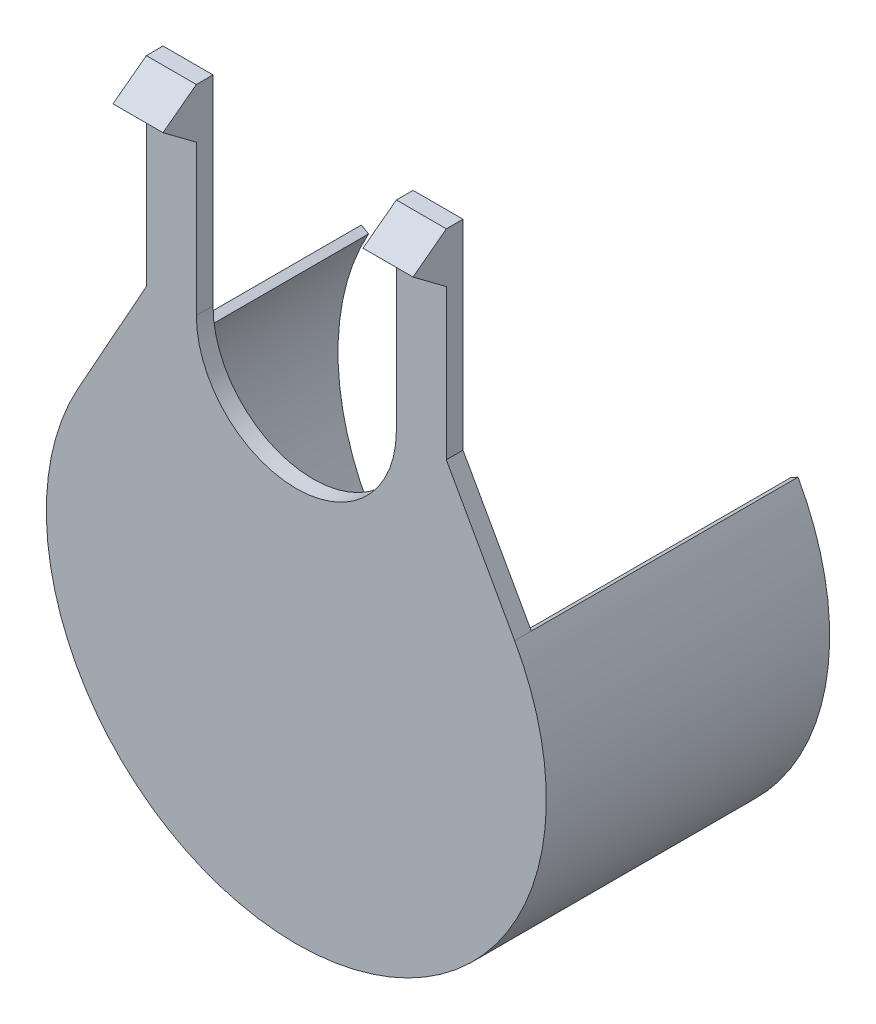
ISO-10303-21;
HEADER;
FILE_DESCRIPTION(('STEP AP214'),'2;1');
FILE_NAME('part.step','',(''),(''),'','','');
FILE_SCHEMA(('AUTOMOTIVE_DESIGN { 1 0 10303 214 1 1 1 1 }'));
ENDSEC;
DATA;
#1=APPLICATION_CONTEXT('core data for automotive mechanical design processes');
#2=APPLICATION_PROTOCOL_DEFINITION('international standard','automotive_design',2000,#1);
#3=PRODUCT_CONTEXT('',#1,'mechanical');
#4=PRODUCT('Part','Part','',(#3));
#5=PRODUCT_RELATED_PRODUCT_CATEGORY('part','',(#4));
#6=PRODUCT_DEFINITION_FORMATION('','',#4);
#7=PRODUCT_DEFINITION_CONTEXT('part definition',#1,'design');
#8=PRODUCT_DEFINITION('design','',#6,#7);
#9=PRODUCT_DEFINITION_SHAPE('','',#8);
#10=(LENGTH_UNIT() NAMED_UNIT(*) SI_UNIT(.MILLI.,.METRE.));
#11=(NAMED_UNIT(*) PLANE_ANGLE_UNIT() SI_UNIT($,.RADIAN.));
#12=(NAMED_UNIT(*) SI_UNIT($,.STERADIAN.) SOLID_ANGLE_UNIT());
#13=UNCERTAINTY_MEASURE_WITH_UNIT(LENGTH_MEASURE(1.E-05),#10,'distance_accuracy_value','');
#14=(GEOMETRIC_REPRESENTATION_CONTEXT(3) GLOBAL_UNCERTAINTY_ASSIGNED_CONTEXT((#13)) GLOBAL_UNIT_ASSIGNED_CONTEXT((#10,
#11,#12)) REPRESENTATION_CONTEXT('',''));
#15=CARTESIAN_POINT('',(0.,0.,0.));
#16=DIRECTION('',(0.,0.,1.));
#17=DIRECTION('',(1.,0.,0.));
#18=AXIS2_PLACEMENT_3D('',#15,#16,#17);
#19=CARTESIAN_POINT('',(0.,-73.2878763910552,5.));
#20=DIRECTION('',(0.,0.,1.));
#21=DIRECTION('',(1.,0.,0.));
#22=AXIS2_PLACEMENT_3D('',#19,#20,#21);
#23=PLANE('',#22);
#24=DIRECTION('',(0.,1.,0.));
#25=VECTOR('',#24,1.);
#26=CARTESIAN_POINT('',(-30.,0.,5.));
#27=LINE('',#26,#25);
#28=CARTESIAN_POINT('',(-30.,0.,5.));
#29=VERTEX_POINT('',#28);
#30=CARTESIAN_POINT('',(-30.,45.,5.));
#31=VERTEX_POINT('',#30);
#32=EDGE_CURVE('E48',#29,#31,#27,.T.);
#33=ORIENTED_EDGE('',*,*,#32,.T.);
#34=DIRECTION('',(-1.,0.,0.));
#35=VECTOR('',#34,1.);
#36=CARTESIAN_POINT('',(-30.,45.,5.));
#37=LINE('',#36,#35);
#38=CARTESIAN_POINT('',(-45.,45.,5.));
#39=VERTEX_POINT('',#38);
#40=EDGE_CURVE('E170',#31,#39,#37,.T.);
#41=ORIENTED_EDGE('',*,*,#40,.T.);
#42=DIRECTION('',(0.,-1.,0.));
#43=VECTOR('',#42,1.);
#44=CARTESIAN_POINT('',(-45.,0.,5.));
#45=LINE('',#44,#43);
#46=CARTESIAN_POINT('',(-45.,0.,5.));
#47=VERTEX_POINT('',#46);
#48=EDGE_CURVE('E304',#39,#47,#45,.T.);
#49=ORIENTED_EDGE('',*,*,#48,.T.);
#50=DIRECTION('',(-0.48711859933517,-0.873335828980892,0.));
#51=VECTOR('',#50,1.);
#52=CARTESIAN_POINT('',(-45.,0.,5.));
#53=LINE('',#52,#51);
#54=CARTESIAN_POINT('',(-65.5001871735669,-36.7539814409175,5.));
#55=VERTEX_POINT('',#54);
#56=EDGE_CURVE('E272',#47,#55,#53,.T.);
#57=ORIENTED_EDGE('',*,*,#56,.T.);
#58=CARTESIAN_POINT('',(0.,-73.2878763910552,5.));
#59=DIRECTION('',(0.,0.,1.));
#60=DIRECTION('',(1.,0.,0.));
#61=AXIS2_PLACEMENT_3D('',#58,#59,#60);
#62=CIRCLE('',#61,75.);
#63=CARTESIAN_POINT('',(65.500187173567,-36.7539814409175,5.));
#64=VERTEX_POINT('',#63);
#65=EDGE_CURVE('E250',#55,#64,#62,.T.);
#66=ORIENTED_EDGE('',*,*,#65,.T.);
#67=DIRECTION('',(-0.48711859933517,0.873335828980892,0.));
#68=VECTOR('',#67,1.);
#69=CARTESIAN_POINT('',(45.,0.,5.));
#70=LINE('',#69,#68);
#71=CARTESIAN_POINT('',(45.,0.,5.));
#72=VERTEX_POINT('',#71);
#73=EDGE_CURVE('E276',#64,#72,#70,.T.);
#74=ORIENTED_EDGE('',*,*,#73,.T.);
#75=DIRECTION('',(0.,1.,0.));
#76=VECTOR('',#75,1.);
#77=CARTESIAN_POINT('',(45.,0.,5.));
#78=LINE('',#77,#76);
#79=CARTESIAN_POINT('',(45.,45.,5.));
#80=VERTEX_POINT('',#79);
#81=EDGE_CURVE('E278',#72,#80,#78,.T.);
#82=ORIENTED_EDGE('',*,*,#81,.T.);
#83=DIRECTION('',(1.,0.,0.));
#84=VECTOR('',#83,1.);
#85=CARTESIAN_POINT('',(30.,45.,5.));
#86=LINE('',#85,#84);
#87=CARTESIAN_POINT('',(30.,45.,5.));
#88=VERTEX_POINT('',#87);
#89=EDGE_CURVE('E201',#88,#80,#86,.T.);
#90=ORIENTED_EDGE('',*,*,#89,.F.);
#91=DIRECTION('',(0.,-1.,0.));
#92=VECTOR('',#91,1.);
#93=CARTESIAN_POINT('',(30.,0.,5.));
#94=LINE('',#93,#92);
#95=CARTESIAN_POINT('',(30.,0.,5.));
#96=VERTEX_POINT('',#95);
#97=EDGE_CURVE('E206',#88,#96,#94,.T.);
#98=ORIENTED_EDGE('',*,*,#97,.T.);
#99=CARTESIAN_POINT('',(0.,0.,5.));
#100=DIRECTION('',(0.,0.,-1.));
#101=DIRECTION('',(1.,0.,0.));
#102=AXIS2_PLACEMENT_3D('',#99,#100,#101);
#103=CIRCLE('',#102,30.);
#104=EDGE_CURVE('E323',#96,#29,#103,.T.);
#105=ORIENTED_EDGE('',*,*,#104,.T.);
#106=EDGE_LOOP('',(#33,#41,#49,#57,#66,#74,#82,#90,#98,#105));
#107=FACE_BOUND('',#106,.T.);
#108=ADVANCED_FACE('F33',(#107),#23,.T.);
#109=CARTESIAN_POINT('',(0.,-73.2878763910552,0.));
#110=DIRECTION('',(0.,0.,1.));
#111=DIRECTION('',(1.,0.,0.));
#112=AXIS2_PLACEMENT_3D('',#109,#110,#111);
#113=PLANE('',#112);
#114=DIRECTION('',(0.873335828980892,0.48711859933517,0.));
#115=VECTOR('',#114,1.);
#116=CARTESIAN_POINT('',(65.500187173567,-36.7539814409175,0.));
#117=LINE('',#116,#115);
#118=CARTESIAN_POINT('',(60.696840114172,-39.4331337372609,0.));
#119=VERTEX_POINT('',#118);
#120=CARTESIAN_POINT('',(65.500187173567,-36.7539814409175,0.));
#121=VERTEX_POINT('',#120);
#122=EDGE_CURVE('E56',#119,#121,#117,.T.);
#123=ORIENTED_EDGE('',*,*,#122,.F.);
#124=CARTESIAN_POINT('',(0.,-73.2878763910552,0.));
#125=DIRECTION('',(0.,0.,1.));
#126=DIRECTION('',(1.,0.,0.));
#127=AXIS2_PLACEMENT_3D('',#124,#125,#126);
#128=CIRCLE('',#127,69.5);
#129=CARTESIAN_POINT('',(-60.696840114172,-39.4331337372609,0.));
#130=VERTEX_POINT('',#129);
#131=EDGE_CURVE('E220',#119,#130,#128,.F.);
#132=ORIENTED_EDGE('',*,*,#131,.T.);
#133=DIRECTION('',(0.873335828980893,-0.487118599335168,0.));
#134=VECTOR('',#133,1.);
#135=CARTESIAN_POINT('',(-63.3168476011147,-37.9717779392554,0.));
#136=LINE('',#135,#134);
#137=CARTESIAN_POINT('',(-65.5001871735669,-36.7539814409175,0.));
#138=VERTEX_POINT('',#137);
#139=EDGE_CURVE('E205',#138,#130,#136,.T.);
#140=ORIENTED_EDGE('',*,*,#139,.F.);
#141=DIRECTION('',(-0.48711859933517,-0.873335828980892,0.));
#142=VECTOR('',#141,1.);
#143=CARTESIAN_POINT('',(-45.,0.,0.));
#144=LINE('',#143,#142);
#145=CARTESIAN_POINT('',(-45.,0.,0.));
#146=VERTEX_POINT('',#145);
#147=EDGE_CURVE('E239',#146,#138,#144,.T.);
#148=ORIENTED_EDGE('',*,*,#147,.F.);
#149=DIRECTION('',(0.,-1.,0.));
#150=VECTOR('',#149,1.);
#151=CARTESIAN_POINT('',(-45.,0.,0.));
#152=LINE('',#151,#150);
#153=CARTESIAN_POINT('',(-45.,60.,0.));
#154=VERTEX_POINT('',#153);
#155=EDGE_CURVE('E274',#154,#146,#152,.T.);
#156=ORIENTED_EDGE('',*,*,#155,.F.);
#157=DIRECTION('',(-1.,0.,0.));
#158=VECTOR('',#157,1.);
#159=CARTESIAN_POINT('',(-45.,60.,0.));
#160=LINE('',#159,#158);
#161=CARTESIAN_POINT('',(-30.,60.,0.));
#162=VERTEX_POINT('',#161);
#163=EDGE_CURVE('E306',#162,#154,#160,.T.);
#164=ORIENTED_EDGE('',*,*,#163,.F.);
#165=DIRECTION('',(0.,1.,0.));
#166=VECTOR('',#165,1.);
#167=CARTESIAN_POINT('',(-30.,0.,0.));
#168=LINE('',#167,#166);
#169=CARTESIAN_POINT('',(-30.,0.,0.));
#170=VERTEX_POINT('',#169);
#171=EDGE_CURVE('E308',#170,#162,#168,.T.);
#172=ORIENTED_EDGE('',*,*,#171,.F.);
#173=CARTESIAN_POINT('',(0.,0.,0.));
#174=DIRECTION('',(0.,0.,-1.));
#175=DIRECTION('',(1.,0.,0.));
#176=AXIS2_PLACEMENT_3D('',#173,#174,#175);
#177=CIRCLE('',#176,30.);
#178=CARTESIAN_POINT('',(30.,0.,0.));
#179=VERTEX_POINT('',#178);
#180=EDGE_CURVE('E310',#179,#170,#177,.T.);
#181=ORIENTED_EDGE('',*,*,#180,.F.);
#182=DIRECTION('',(0.,-1.,0.));
#183=VECTOR('',#182,1.);
#184=CARTESIAN_POINT('',(30.,0.,0.));
#185=LINE('',#184,#183);
#186=CARTESIAN_POINT('',(30.,60.,0.));
#187=VERTEX_POINT('',#186);
#188=EDGE_CURVE('E312',#187,#179,#185,.T.);
#189=ORIENTED_EDGE('',*,*,#188,.F.);
#190=DIRECTION('',(-1.,0.,0.));
#191=VECTOR('',#190,1.);
#192=CARTESIAN_POINT('',(45.,60.,0.));
#193=LINE('',#192,#191);
#194=CARTESIAN_POINT('',(45.,60.,0.));
#195=VERTEX_POINT('',#194);
#196=EDGE_CURVE('E314',#195,#187,#193,.T.);
#197=ORIENTED_EDGE('',*,*,#196,.F.);
#198=DIRECTION('',(0.,1.,0.));
#199=VECTOR('',#198,1.);
#200=CARTESIAN_POINT('',(45.,0.,0.));
#201=LINE('',#200,#199);
#202=CARTESIAN_POINT('',(45.,0.,0.));
#203=VERTEX_POINT('',#202);
#204=EDGE_CURVE('E316',#203,#195,#201,.T.);
#205=ORIENTED_EDGE('',*,*,#204,.F.);
#206=DIRECTION('',(-0.48711859933517,0.873335828980892,0.));
#207=VECTOR('',#206,1.);
#208=CARTESIAN_POINT('',(45.,0.,0.));
#209=LINE('',#208,#207);
#210=EDGE_CURVE('E260',#121,#203,#209,.T.);
#211=ORIENTED_EDGE('',*,*,#210,.F.);
#212=EDGE_LOOP('',(#123,#132,#140,#148,#156,#164,#172,#181,#189,#197,#205,#211));
#213=FACE_BOUND('',#212,.T.);
#214=ADVANCED_FACE('F234',(#213),#113,.F.);
#215=CARTESIAN_POINT('',(-45.,0.,5.));
#216=DIRECTION('',(0.873335828980892,-0.48711859933517,0.));
#217=DIRECTION('',(0.48711859933517,0.873335828980893,0.));
#218=AXIS2_PLACEMENT_3D('',#215,#216,#217);
#219=PLANE('',#218);
#220=ORIENTED_EDGE('',*,*,#147,.T.);
#221=DIRECTION('',(0.,0.,-1.));
#222=VECTOR('',#221,1.);
#223=CARTESIAN_POINT('',(-65.5001871735669,-36.7539814409175,5.));
#224=LINE('',#223,#222);
#225=EDGE_CURVE('E221',#55,#138,#224,.T.);
#226=ORIENTED_EDGE('',*,*,#225,.F.);
#227=ORIENTED_EDGE('',*,*,#56,.F.);
#228=DIRECTION('',(0.,0.,-1.));
#229=VECTOR('',#228,1.);
#230=CARTESIAN_POINT('',(-45.,0.,5.));
#231=LINE('',#230,#229);
#232=EDGE_CURVE('E259',#47,#146,#231,.T.);
#233=ORIENTED_EDGE('',*,*,#232,.T.);
#234=EDGE_LOOP('',(#220,#226,#227,#233));
#235=FACE_BOUND('',#234,.T.);
#236=ADVANCED_FACE('F257',(#235),#219,.F.);
#237=CARTESIAN_POINT('',(0.,-73.2878763910552,5.));
#238=DIRECTION('',(0.,0.,-1.));
#239=DIRECTION('',(-1.,0.,0.));
#240=AXIS2_PLACEMENT_3D('',#237,#238,#239);
#241=CYLINDRICAL_SURFACE('',#240,75.);
#242=ORIENTED_EDGE('',*,*,#225,.T.);
#243=DIRECTION('',(0.,0.,1.));
#244=VECTOR('',#243,1.);
#245=CARTESIAN_POINT('',(-65.5001871735669,-36.7539814409175,-80.));
#246=LINE('',#245,#244);
#247=CARTESIAN_POINT('',(-65.5001871735669,-36.7539814409175,-80.));
#248=VERTEX_POINT('',#247);
#249=EDGE_CURVE('E248',#248,#138,#246,.T.);
#250=ORIENTED_EDGE('',*,*,#249,.F.);
#251=CARTESIAN_POINT('',(0.,-73.2878763910552,-80.));
#252=DIRECTION('',(0.,0.,-1.));
#253=DIRECTION('',(-1.,0.,0.));
#254=AXIS2_PLACEMENT_3D('',#251,#252,#253);
#255=CIRCLE('',#254,75.);
#256=CARTESIAN_POINT('',(65.500187173567,-36.7539814409175,-80.));
#257=VERTEX_POINT('',#256);
#258=EDGE_CURVE('E551',#257,#248,#255,.T.);
#259=ORIENTED_EDGE('',*,*,#258,.F.);
#260=DIRECTION('',(0.,0.,1.));
#261=VECTOR('',#260,1.);
#262=CARTESIAN_POINT('',(65.500187173567,-36.7539814409175,-80.));
#263=LINE('',#262,#261);
#264=EDGE_CURVE('E558',#257,#121,#263,.T.);
#265=ORIENTED_EDGE('',*,*,#264,.T.);
#266=DIRECTION('',(0.,0.,-1.));
#267=VECTOR('',#266,1.);
#268=CARTESIAN_POINT('',(65.500187173567,-36.7539814409175,5.));
#269=LINE('',#268,#267);
#270=EDGE_CURVE('E254',#64,#121,#269,.T.);
#271=ORIENTED_EDGE('',*,*,#270,.F.);
#272=ORIENTED_EDGE('',*,*,#65,.F.);
#273=EDGE_LOOP('',(#242,#250,#259,#265,#271,#272));
#274=FACE_BOUND('',#273,.T.);
#275=ADVANCED_FACE('F246',(#274),#241,.T.);
#276=CARTESIAN_POINT('',(45.,0.,5.));
#277=DIRECTION('',(-0.873335828980892,-0.48711859933517,0.));
#278=DIRECTION('',(0.48711859933517,-0.873335828980892,0.));
#279=AXIS2_PLACEMENT_3D('',#276,#277,#278);
#280=PLANE('',#279);
#281=ORIENTED_EDGE('',*,*,#210,.T.);
#282=DIRECTION('',(0.,0.,-1.));
#283=VECTOR('',#282,1.);
#284=CARTESIAN_POINT('',(45.,0.,5.));
#285=LINE('',#284,#283);
#286=EDGE_CURVE('E284',#72,#203,#285,.T.);
#287=ORIENTED_EDGE('',*,*,#286,.F.);
#288=ORIENTED_EDGE('',*,*,#73,.F.);
#289=ORIENTED_EDGE('',*,*,#270,.T.);
#290=EDGE_LOOP('',(#281,#287,#288,#289));
#291=FACE_BOUND('',#290,.T.);
#292=ADVANCED_FACE('F381',(#291),#280,.F.);
#293=CARTESIAN_POINT('',(45.,0.,5.));
#294=DIRECTION('',(-1.,0.,0.));
#295=DIRECTION('',(0.,0.,1.));
#296=AXIS2_PLACEMENT_3D('',#293,#294,#295);
#297=PLANE('',#296);
#298=ORIENTED_EDGE('',*,*,#204,.T.);
#299=DIRECTION('',(0.,0.,-1.));
#300=VECTOR('',#299,1.);
#301=CARTESIAN_POINT('',(45.,60.,5.));
#302=LINE('',#301,#300);
#303=CARTESIAN_POINT('',(45.,60.,5.));
#304=VERTEX_POINT('',#303);
#305=EDGE_CURVE('E287',#304,#195,#302,.T.);
#306=ORIENTED_EDGE('',*,*,#305,.F.);
#307=DIRECTION('',(0.,-0.601361720782066,0.798976896272997));
#308=VECTOR('',#307,1.);
#309=CARTESIAN_POINT('',(45.,60.,5.));
#310=LINE('',#309,#308);
#311=CARTESIAN_POINT('',(45.,52.4733528142397,15.));
#312=VERTEX_POINT('',#311);
#313=EDGE_CURVE('E180',#304,#312,#310,.T.);
#314=ORIENTED_EDGE('',*,*,#313,.T.);
#315=DIRECTION('',(0.,-0.598633044000098,-0.801023394559221));
#316=VECTOR('',#315,1.);
#317=CARTESIAN_POINT('',(45.,52.4733528142397,15.));
#318=LINE('',#317,#316);
#319=EDGE_CURVE('E193',#312,#80,#318,.T.);
#320=ORIENTED_EDGE('',*,*,#319,.T.);
#321=ORIENTED_EDGE('',*,*,#81,.F.);
#322=ORIENTED_EDGE('',*,*,#286,.T.);
#323=EDGE_LOOP('',(#298,#306,#314,#320,#321,#322));
#324=FACE_BOUND('',#323,.T.);
#325=ADVANCED_FACE('F344',(#324),#297,.F.);
#326=CARTESIAN_POINT('',(45.,60.,5.));
#327=DIRECTION('',(0.,-1.,0.));
#328=DIRECTION('',(0.,0.,-1.));
#329=AXIS2_PLACEMENT_3D('',#326,#327,#328);
#330=PLANE('',#329);
#331=ORIENTED_EDGE('',*,*,#196,.T.);
#332=DIRECTION('',(0.,0.,-1.));
#333=VECTOR('',#332,1.);
#334=CARTESIAN_POINT('',(30.,60.,5.));
#335=LINE('',#334,#333);
#336=CARTESIAN_POINT('',(30.,60.,5.));
#337=VERTEX_POINT('',#336);
#338=EDGE_CURVE('E290',#337,#187,#335,.T.);
#339=ORIENTED_EDGE('',*,*,#338,.F.);
#340=DIRECTION('',(-1.,0.,0.));
#341=VECTOR('',#340,1.);
#342=CARTESIAN_POINT('',(45.,60.,5.));
#343=LINE('',#342,#341);
#344=EDGE_CURVE('E281',#304,#337,#343,.T.);
#345=ORIENTED_EDGE('',*,*,#344,.F.);
#346=ORIENTED_EDGE('',*,*,#305,.T.);
#347=EDGE_LOOP('',(#331,#339,#345,#346));
#348=FACE_BOUND('',#347,.T.);
#349=ADVANCED_FACE('F348',(#348),#330,.F.);
#350=CARTESIAN_POINT('',(30.,0.,5.));
#351=DIRECTION('',(1.,0.,0.));
#352=DIRECTION('',(0.,0.,-1.));
#353=AXIS2_PLACEMENT_3D('',#350,#351,#352);
#354=PLANE('',#353);
#355=ORIENTED_EDGE('',*,*,#188,.T.);
#356=DIRECTION('',(0.,0.,-1.));
#357=VECTOR('',#356,1.);
#358=CARTESIAN_POINT('',(30.,0.,5.));
#359=LINE('',#358,#357);
#360=EDGE_CURVE('E293',#96,#179,#359,.T.);
#361=ORIENTED_EDGE('',*,*,#360,.F.);
#362=ORIENTED_EDGE('',*,*,#97,.F.);
#363=DIRECTION('',(0.,-0.598633044000098,-0.801023394559221));
#364=VECTOR('',#363,1.);
#365=CARTESIAN_POINT('',(30.,52.4733528142397,15.));
#366=LINE('',#365,#364);
#367=CARTESIAN_POINT('',(30.,52.4733528142397,15.));
#368=VERTEX_POINT('',#367);
#369=EDGE_CURVE('E192',#368,#88,#366,.T.);
#370=ORIENTED_EDGE('',*,*,#369,.F.);
#371=DIRECTION('',(0.,-0.601361720782066,0.798976896272997));
#372=VECTOR('',#371,1.);
#373=CARTESIAN_POINT('',(30.,60.,5.));
#374=LINE('',#373,#372);
#375=EDGE_CURVE('E189',#337,#368,#374,.T.);
#376=ORIENTED_EDGE('',*,*,#375,.F.);
#377=ORIENTED_EDGE('',*,*,#338,.T.);
#378=EDGE_LOOP('',(#355,#361,#362,#370,#376,#377));
#379=FACE_BOUND('',#378,.T.);
#380=ADVANCED_FACE('F338',(#379),#354,.F.);
#381=CARTESIAN_POINT('',(0.,0.,5.));
#382=DIRECTION('',(0.,0.,-1.));
#383=DIRECTION('',(-1.,0.,0.));
#384=AXIS2_PLACEMENT_3D('',#381,#382,#383);
#385=CYLINDRICAL_SURFACE('',#384,30.);
#386=ORIENTED_EDGE('',*,*,#180,.T.);
#387=DIRECTION('',(0.,0.,-1.));
#388=VECTOR('',#387,1.);
#389=CARTESIAN_POINT('',(-30.,0.,5.));
#390=LINE('',#389,#388);
#391=EDGE_CURVE('E296',#29,#170,#390,.T.);
#392=ORIENTED_EDGE('',*,*,#391,.F.);
#393=ORIENTED_EDGE('',*,*,#104,.F.);
#394=ORIENTED_EDGE('',*,*,#360,.T.);
#395=EDGE_LOOP('',(#386,#392,#393,#394));
#396=FACE_BOUND('',#395,.T.);
#397=ADVANCED_FACE('F352',(#396),#385,.F.);
#398=CARTESIAN_POINT('',(-30.,0.,5.));
#399=DIRECTION('',(-1.,0.,0.));
#400=DIRECTION('',(0.,0.,1.));
#401=AXIS2_PLACEMENT_3D('',#398,#399,#400);
#402=PLANE('',#401);
#403=ORIENTED_EDGE('',*,*,#171,.T.);
#404=DIRECTION('',(0.,0.,-1.));
#405=VECTOR('',#404,1.);
#406=CARTESIAN_POINT('',(-30.,60.,5.));
#407=LINE('',#406,#405);
#408=CARTESIAN_POINT('',(-30.,60.,5.));
#409=VERTEX_POINT('',#408);
#410=EDGE_CURVE('E166',#409,#162,#407,.T.);
#411=ORIENTED_EDGE('',*,*,#410,.F.);
#412=DIRECTION('',(0.,-0.601361720782066,0.798976896272997));
#413=VECTOR('',#412,1.);
#414=CARTESIAN_POINT('',(-30.,60.,5.));
#415=LINE('',#414,#413);
#416=CARTESIAN_POINT('',(-30.,52.4733528142397,15.));
#417=VERTEX_POINT('',#416);
#418=EDGE_CURVE('E159',#409,#417,#415,.T.);
#419=ORIENTED_EDGE('',*,*,#418,.T.);
#420=DIRECTION('',(0.,-0.598633044000098,-0.801023394559221));
#421=VECTOR('',#420,1.);
#422=CARTESIAN_POINT('',(-30.,52.4733528142397,15.));
#423=LINE('',#422,#421);
#424=EDGE_CURVE('E163',#417,#31,#423,.T.);
#425=ORIENTED_EDGE('',*,*,#424,.T.);
#426=ORIENTED_EDGE('',*,*,#32,.F.);
#427=ORIENTED_EDGE('',*,*,#391,.T.);
#428=EDGE_LOOP('',(#403,#411,#419,#425,#426,#427));
#429=FACE_BOUND('',#428,.T.);
#430=ADVANCED_FACE('F161',(#429),#402,.F.);
#431=CARTESIAN_POINT('',(-45.,60.,5.));
#432=DIRECTION('',(0.,-1.,0.));
#433=DIRECTION('',(0.,0.,-1.));
#434=AXIS2_PLACEMENT_3D('',#431,#432,#433);
#435=PLANE('',#434);
#436=ORIENTED_EDGE('',*,*,#163,.T.);
#437=DIRECTION('',(0.,0.,-1.));
#438=VECTOR('',#437,1.);
#439=CARTESIAN_POINT('',(-45.,60.,5.));
#440=LINE('',#439,#438);
#441=CARTESIAN_POINT('',(-45.,60.,5.));
#442=VERTEX_POINT('',#441);
#443=EDGE_CURVE('E300',#442,#154,#440,.T.);
#444=ORIENTED_EDGE('',*,*,#443,.F.);
#445=DIRECTION('',(-1.,0.,0.));
#446=VECTOR('',#445,1.);
#447=CARTESIAN_POINT('',(-45.,60.,5.));
#448=LINE('',#447,#446);
#449=EDGE_CURVE('E320',#409,#442,#448,.T.);
#450=ORIENTED_EDGE('',*,*,#449,.F.);
#451=ORIENTED_EDGE('',*,*,#410,.T.);
#452=EDGE_LOOP('',(#436,#444,#450,#451));
#453=FACE_BOUND('',#452,.T.);
#454=ADVANCED_FACE('F355',(#453),#435,.F.);
#455=CARTESIAN_POINT('',(-45.,0.,5.));
#456=DIRECTION('',(1.,0.,0.));
#457=DIRECTION('',(0.,0.,-1.));
#458=AXIS2_PLACEMENT_3D('',#455,#456,#457);
#459=PLANE('',#458);
#460=ORIENTED_EDGE('',*,*,#155,.T.);
#461=ORIENTED_EDGE('',*,*,#232,.F.);
#462=ORIENTED_EDGE('',*,*,#48,.F.);
#463=DIRECTION('',(0.,-0.598633044000098,-0.801023394559221));
#464=VECTOR('',#463,1.);
#465=CARTESIAN_POINT('',(-45.,52.4733528142397,15.));
#466=LINE('',#465,#464);
#467=CARTESIAN_POINT('',(-45.,52.4733528142397,15.));
#468=VERTEX_POINT('',#467);
#469=EDGE_CURVE('E184',#468,#39,#466,.T.);
#470=ORIENTED_EDGE('',*,*,#469,.F.);
#471=DIRECTION('',(0.,-0.601361720782066,0.798976896272997));
#472=VECTOR('',#471,1.);
#473=CARTESIAN_POINT('',(-45.,60.,5.));
#474=LINE('',#473,#472);
#475=EDGE_CURVE('E176',#442,#468,#474,.T.);
#476=ORIENTED_EDGE('',*,*,#475,.F.);
#477=ORIENTED_EDGE('',*,*,#443,.T.);
#478=EDGE_LOOP('',(#460,#461,#462,#470,#476,#477));
#479=FACE_BOUND('',#478,.T.);
#480=ADVANCED_FACE('F357',(#479),#459,.F.);
#481=CARTESIAN_POINT('',(-63.3168476011147,-37.9717779392554,-80.));
#482=DIRECTION('',(-0.487118599335168,-0.873335828980893,0.));
#483=DIRECTION('',(0.873335828980893,-0.487118599335168,0.));
#484=AXIS2_PLACEMENT_3D('',#481,#482,#483);
#485=PLANE('',#484);
#486=ORIENTED_EDGE('',*,*,#139,.T.);
#487=CARTESIAN_POINT('',(-60.696840114172,-39.433133737261,-3.));
#488=DIRECTION('',(-0.487118599335168,-0.873335828980893,0.));
#489=DIRECTION('',(0.873335828980893,-0.487118599335168,0.));
#490=AXIS2_PLACEMENT_3D('',#487,#488,#489);
#491=CIRCLE('',#490,3.);
#492=CARTESIAN_POINT('',(-63.3168476011147,-37.9717779392554,-3.));
#493=VERTEX_POINT('',#492);
#494=EDGE_CURVE('E11',#130,#493,#491,.T.);
#495=ORIENTED_EDGE('',*,*,#494,.T.);
#496=DIRECTION('',(0.,0.,1.));
#497=VECTOR('',#496,1.);
#498=CARTESIAN_POINT('',(-63.3168476011147,-37.9717779392554,-80.));
#499=LINE('',#498,#497);
#500=CARTESIAN_POINT('',(-63.3168476011147,-37.9717779392554,-80.));
#501=VERTEX_POINT('',#500);
#502=EDGE_CURVE('E266',#501,#493,#499,.T.);
#503=ORIENTED_EDGE('',*,*,#502,.F.);
#504=DIRECTION('',(0.873335828980893,-0.487118599335168,0.));
#505=VECTOR('',#504,1.);
#506=CARTESIAN_POINT('',(-63.3168476011147,-37.9717779392554,-80.));
#507=LINE('',#506,#505);
#508=EDGE_CURVE('E264',#248,#501,#507,.T.);
#509=ORIENTED_EDGE('',*,*,#508,.F.);
#510=ORIENTED_EDGE('',*,*,#249,.T.);
#511=EDGE_LOOP('',(#486,#495,#503,#509,#510));
#512=FACE_BOUND('',#511,.T.);
#513=ADVANCED_FACE('F262',(#512),#485,.F.);
#514=CARTESIAN_POINT('',(0.,-73.2878763910552,-80.));
#515=DIRECTION('',(0.,0.,1.));
#516=DIRECTION('',(1.,0.,0.));
#517=AXIS2_PLACEMENT_3D('',#514,#515,#516);
#518=CYLINDRICAL_SURFACE('',#517,72.5);
#519=ORIENTED_EDGE('',*,*,#502,.T.);
#520=CARTESIAN_POINT('',(0.,-73.2878763910552,-3.));
#521=DIRECTION('',(0.,0.,1.));
#522=DIRECTION('',(1.,0.,0.));
#523=AXIS2_PLACEMENT_3D('',#520,#521,#522);
#524=CIRCLE('',#523,72.5);
#525=CARTESIAN_POINT('',(63.3168476011147,-37.9717779392554,-3.));
#526=VERTEX_POINT('',#525);
#527=EDGE_CURVE('E217',#493,#526,#524,.T.);
#528=ORIENTED_EDGE('',*,*,#527,.T.);
#529=DIRECTION('',(0.,0.,1.));
#530=VECTOR('',#529,1.);
#531=CARTESIAN_POINT('',(63.3168476011147,-37.9717779392554,-80.));
#532=LINE('',#531,#530);
#533=CARTESIAN_POINT('',(63.3168476011147,-37.9717779392554,-80.));
#534=VERTEX_POINT('',#533);
#535=EDGE_CURVE('E230',#534,#526,#532,.T.);
#536=ORIENTED_EDGE('',*,*,#535,.F.);
#537=CARTESIAN_POINT('',(0.,-73.2878763910552,-80.));
#538=DIRECTION('',(0.,0.,1.));
#539=DIRECTION('',(-1.,0.,0.));
#540=AXIS2_PLACEMENT_3D('',#537,#538,#539);
#541=CIRCLE('',#540,72.5);
#542=EDGE_CURVE('E553',#501,#534,#541,.T.);
#543=ORIENTED_EDGE('',*,*,#542,.F.);
#544=EDGE_LOOP('',(#519,#528,#536,#543));
#545=FACE_BOUND('',#544,.T.);
#546=ADVANCED_FACE('F436',(#545),#518,.F.);
#547=CARTESIAN_POINT('',(65.500187173567,-36.7539814409175,-80.));
#548=DIRECTION('',(0.48711859933517,-0.873335828980892,0.));
#549=DIRECTION('',(0.873335828980892,0.48711859933517,0.));
#550=AXIS2_PLACEMENT_3D('',#547,#548,#549);
#551=PLANE('',#550);
#552=ORIENTED_EDGE('',*,*,#122,.T.);
#553=ORIENTED_EDGE('',*,*,#264,.F.);
#554=DIRECTION('',(0.873335828980892,0.48711859933517,0.));
#555=VECTOR('',#554,1.);
#556=CARTESIAN_POINT('',(65.500187173567,-36.7539814409175,-80.));
#557=LINE('',#556,#555);
#558=EDGE_CURVE('E552',#534,#257,#557,.T.);
#559=ORIENTED_EDGE('',*,*,#558,.F.);
#560=ORIENTED_EDGE('',*,*,#535,.T.);
#561=CARTESIAN_POINT('',(60.696840114172,-39.4331337372609,-3.));
#562=DIRECTION('',(0.48711859933517,-0.873335828980892,0.));
#563=DIRECTION('',(0.873335828980892,0.48711859933517,0.));
#564=AXIS2_PLACEMENT_3D('',#561,#562,#563);
#565=CIRCLE('',#564,3.);
#566=EDGE_CURVE('E41',#526,#119,#565,.T.);
#567=ORIENTED_EDGE('',*,*,#566,.T.);
#568=EDGE_LOOP('',(#552,#553,#559,#560,#567));
#569=FACE_BOUND('',#568,.T.);
#570=ADVANCED_FACE('F225',(#569),#551,.F.);
#571=CARTESIAN_POINT('',(0.,-73.2878763910552,-80.));
#572=DIRECTION('',(0.,0.,-1.));
#573=DIRECTION('',(-1.,0.,0.));
#574=AXIS2_PLACEMENT_3D('',#571,#572,#573);
#575=PLANE('',#574);
#576=ORIENTED_EDGE('',*,*,#258,.T.);
#577=ORIENTED_EDGE('',*,*,#508,.T.);
#578=ORIENTED_EDGE('',*,*,#542,.T.);
#579=ORIENTED_EDGE('',*,*,#558,.T.);
#580=EDGE_LOOP('',(#576,#577,#578,#579));
#581=FACE_BOUND('',#580,.T.);
#582=ADVANCED_FACE('F448',(#581),#575,.T.);
#583=CARTESIAN_POINT('',(30.,52.4733528142397,15.));
#584=DIRECTION('',(0.,-0.801023394559221,0.598633044000098));
#585=DIRECTION('',(0.,-0.598633044000098,-0.801023394559221));
#586=AXIS2_PLACEMENT_3D('',#583,#584,#585);
#587=PLANE('',#586);
#588=ORIENTED_EDGE('',*,*,#319,.F.);
#589=DIRECTION('',(1.,0.,0.));
#590=VECTOR('',#589,1.);
#591=CARTESIAN_POINT('',(30.,52.4733528142397,15.));
#592=LINE('',#591,#590);
#593=EDGE_CURVE('E198',#368,#312,#592,.T.);
#594=ORIENTED_EDGE('',*,*,#593,.F.);
#595=ORIENTED_EDGE('',*,*,#369,.T.);
#596=ORIENTED_EDGE('',*,*,#89,.T.);
#597=EDGE_LOOP('',(#588,#594,#595,#596));
#598=FACE_BOUND('',#597,.T.);
#599=ADVANCED_FACE('F342',(#598),#587,.T.);
#600=CARTESIAN_POINT('',(30.,60.,5.));
#601=DIRECTION('',(0.,0.798976896272997,0.601361720782066));
#602=DIRECTION('',(0.,-0.601361720782067,0.798976896272998));
#603=AXIS2_PLACEMENT_3D('',#600,#601,#602);
#604=PLANE('',#603);
#605=ORIENTED_EDGE('',*,*,#313,.F.);
#606=ORIENTED_EDGE('',*,*,#344,.T.);
#607=ORIENTED_EDGE('',*,*,#375,.T.);
#608=ORIENTED_EDGE('',*,*,#593,.T.);
#609=EDGE_LOOP('',(#605,#606,#607,#608));
#610=FACE_BOUND('',#609,.T.);
#611=ADVANCED_FACE('F334',(#610),#604,.T.);
#612=CARTESIAN_POINT('',(0.,-73.2878763910552,-3.));
#613=DIRECTION('',(0.,0.,1.));
#614=DIRECTION('',(1.,0.,0.));
#615=AXIS2_PLACEMENT_3D('',#612,#613,#614);
#616=TOROIDAL_SURFACE('',#615,69.5,3.);
#617=ORIENTED_EDGE('',*,*,#494,.F.);
#618=ORIENTED_EDGE('',*,*,#131,.F.);
#619=ORIENTED_EDGE('',*,*,#566,.F.);
#620=ORIENTED_EDGE('',*,*,#527,.F.);
#621=EDGE_LOOP('',(#617,#618,#619,#620));
#622=FACE_BOUND('',#621,.T.);
#623=ADVANCED_FACE('F35',(#622),#616,.F.);
#624=CARTESIAN_POINT('',(-30.,60.,5.));
#625=DIRECTION('',(0.,-0.798976896272997,-0.601361720782066));
#626=DIRECTION('',(0.,0.601361720782067,-0.798976896272998));
#627=AXIS2_PLACEMENT_3D('',#624,#625,#626);
#628=PLANE('',#627);
#629=ORIENTED_EDGE('',*,*,#475,.T.);
#630=DIRECTION('',(-1.,0.,0.));
#631=VECTOR('',#630,1.);
#632=CARTESIAN_POINT('',(-30.,52.4733528142397,15.));
#633=LINE('',#632,#631);
#634=EDGE_CURVE('E173',#417,#468,#633,.T.);
#635=ORIENTED_EDGE('',*,*,#634,.F.);
#636=ORIENTED_EDGE('',*,*,#418,.F.);
#637=ORIENTED_EDGE('',*,*,#449,.T.);
#638=EDGE_LOOP('',(#629,#635,#636,#637));
#639=FACE_BOUND('',#638,.T.);
#640=ADVANCED_FACE('F174',(#639),#628,.F.);
#641=CARTESIAN_POINT('',(-30.,52.4733528142397,15.));
#642=DIRECTION('',(0.,0.801023394559221,-0.598633044000098));
#643=DIRECTION('',(0.,0.598633044000098,0.801023394559221));
#644=AXIS2_PLACEMENT_3D('',#641,#642,#643);
#645=PLANE('',#644);
#646=ORIENTED_EDGE('',*,*,#469,.T.);
#647=ORIENTED_EDGE('',*,*,#40,.F.);
#648=ORIENTED_EDGE('',*,*,#424,.F.);
#649=ORIENTED_EDGE('',*,*,#634,.T.);
#650=EDGE_LOOP('',(#646,#647,#648,#649));
#651=FACE_BOUND('',#650,.T.);
#652=ADVANCED_FACE('F182',(#651),#645,.F.);
#653=CLOSED_SHELL('',(#108,#214,#236,#275,#292,#325,#349,#380,#397,#430,#454,#480,#513,#546,
#570,#582,#599,#611,#623,#640,#652));
#654=MANIFOLD_SOLID_BREP('B2',#653);
#655=ADVANCED_BREP_SHAPE_REPRESENTATION('',(#18,#654),#14);
#656=SHAPE_DEFINITION_REPRESENTATION(#9,#655);
ENDSEC;
END-ISO-10303-21;
